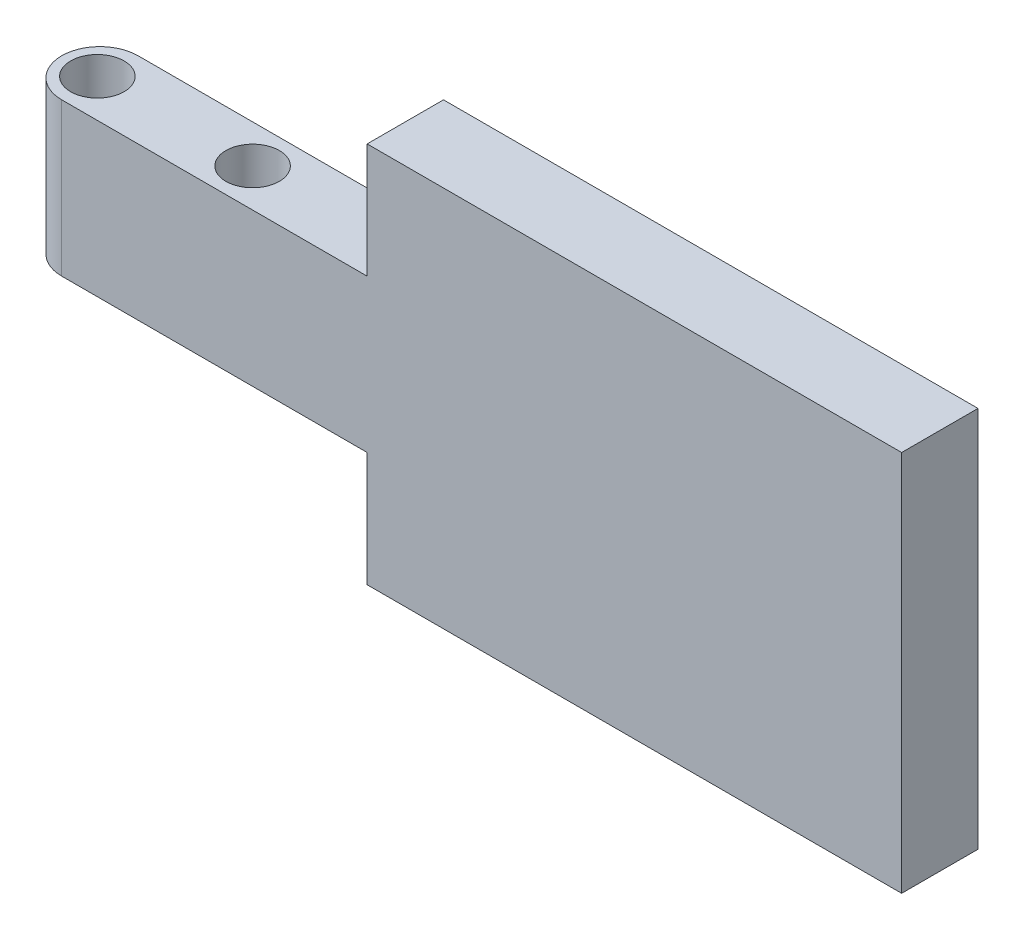
ISO-10303-21;
HEADER;
FILE_DESCRIPTION(('STEP AP214'),'2;1');
FILE_NAME('part.step','',(''),(''),'','','');
FILE_SCHEMA(('AUTOMOTIVE_DESIGN { 1 0 10303 214 1 1 1 1 }'));
ENDSEC;
DATA;
#1=APPLICATION_CONTEXT('core data for automotive mechanical design processes');
#2=APPLICATION_PROTOCOL_DEFINITION('international standard','automotive_design',2000,#1);
#3=PRODUCT_CONTEXT('',#1,'mechanical');
#4=PRODUCT('Part','Part','',(#3));
#5=PRODUCT_RELATED_PRODUCT_CATEGORY('part','',(#4));
#6=PRODUCT_DEFINITION_FORMATION('','',#4);
#7=PRODUCT_DEFINITION_CONTEXT('part definition',#1,'design');
#8=PRODUCT_DEFINITION('design','',#6,#7);
#9=PRODUCT_DEFINITION_SHAPE('','',#8);
#10=(LENGTH_UNIT() NAMED_UNIT(*) SI_UNIT(.MILLI.,.METRE.));
#11=(NAMED_UNIT(*) PLANE_ANGLE_UNIT() SI_UNIT($,.RADIAN.));
#12=(NAMED_UNIT(*) SI_UNIT($,.STERADIAN.) SOLID_ANGLE_UNIT());
#13=UNCERTAINTY_MEASURE_WITH_UNIT(LENGTH_MEASURE(1.E-05),#10,'distance_accuracy_value','');
#14=(GEOMETRIC_REPRESENTATION_CONTEXT(3) GLOBAL_UNCERTAINTY_ASSIGNED_CONTEXT((#13)) GLOBAL_UNIT_ASSIGNED_CONTEXT((#10,
#11,#12)) REPRESENTATION_CONTEXT('',''));
#15=CARTESIAN_POINT('',(0.,0.,0.));
#16=DIRECTION('',(0.,0.,1.));
#17=DIRECTION('',(1.,0.,0.));
#18=AXIS2_PLACEMENT_3D('',#15,#16,#17);
#19=CARTESIAN_POINT('',(-35.,-25.,5.));
#20=DIRECTION('',(1.,0.,0.));
#21=DIRECTION('',(0.,0.,-1.));
#22=AXIS2_PLACEMENT_3D('',#19,#20,#21);
#23=PLANE('',#22);
#24=DIRECTION('',(0.,0.,-1.));
#25=VECTOR('',#24,1.);
#26=CARTESIAN_POINT('',(-35.,10.,-5.));
#27=LINE('',#26,#25);
#28=CARTESIAN_POINT('',(-35.,10.,5.));
#29=VERTEX_POINT('',#28);
#30=CARTESIAN_POINT('',(-35.,10.,-5.));
#31=VERTEX_POINT('',#30);
#32=EDGE_CURVE('E119',#29,#31,#27,.T.);
#33=ORIENTED_EDGE('',*,*,#32,.F.);
#34=DIRECTION('',(0.,1.,0.));
#35=VECTOR('',#34,1.);
#36=CARTESIAN_POINT('',(-35.,-25.,5.));
#37=LINE('',#36,#35);
#38=CARTESIAN_POINT('',(-35.,25.,5.));
#39=VERTEX_POINT('',#38);
#40=EDGE_CURVE('E116',#29,#39,#37,.T.);
#41=ORIENTED_EDGE('',*,*,#40,.T.);
#42=DIRECTION('',(0.,0.,-1.));
#43=VECTOR('',#42,1.);
#44=CARTESIAN_POINT('',(-35.,25.,5.));
#45=LINE('',#44,#43);
#46=CARTESIAN_POINT('',(-35.,25.,-5.));
#47=VERTEX_POINT('',#46);
#48=EDGE_CURVE('E149',#39,#47,#45,.T.);
#49=ORIENTED_EDGE('',*,*,#48,.T.);
#50=DIRECTION('',(0.,1.,0.));
#51=VECTOR('',#50,1.);
#52=CARTESIAN_POINT('',(-35.,-25.,-5.));
#53=LINE('',#52,#51);
#54=EDGE_CURVE('E161',#31,#47,#53,.T.);
#55=ORIENTED_EDGE('',*,*,#54,.F.);
#56=EDGE_LOOP('',(#33,#41,#49,#55));
#57=FACE_BOUND('',#56,.T.);
#58=ADVANCED_FACE('F32',(#57),#23,.F.);
#59=CARTESIAN_POINT('',(-35.,-25.,-5.));
#60=DIRECTION('',(0.,0.,1.));
#61=DIRECTION('',(1.,0.,0.));
#62=AXIS2_PLACEMENT_3D('',#59,#60,#61);
#63=PLANE('',#62);
#64=CARTESIAN_POINT('',(10.,0.,-5.));
#65=DIRECTION('',(0.,0.,1.));
#66=DIRECTION('',(1.,0.,0.));
#67=AXIS2_PLACEMENT_3D('',#64,#65,#66);
#68=CIRCLE('',#67,24.4948974278318);
#69=CARTESIAN_POINT('',(34.4948974278318,0.,-5.));
#70=VERTEX_POINT('',#69);
#71=EDGE_CURVE('E11',#70,#70,#68,.F.);
#72=ORIENTED_EDGE('',*,*,#71,.F.);
#73=EDGE_LOOP('',(#72));
#74=FACE_BOUND('',#73,.T.);
#75=CARTESIAN_POINT('',(-35.,-25.,-5.));
#76=VERTEX_POINT('',#75);
#77=CARTESIAN_POINT('',(-35.,-10.,-5.));
#78=VERTEX_POINT('',#77);
#79=EDGE_CURVE('E162',#76,#78,#53,.T.);
#80=ORIENTED_EDGE('',*,*,#79,.T.);
#81=DIRECTION('',(-1.,0.,0.));
#82=VECTOR('',#81,1.);
#83=CARTESIAN_POINT('',(-75.,-10.,-5.));
#84=LINE('',#83,#82);
#85=CARTESIAN_POINT('',(-75.,-10.,-5.));
#86=VERTEX_POINT('',#85);
#87=EDGE_CURVE('E49',#78,#86,#84,.T.);
#88=ORIENTED_EDGE('',*,*,#87,.T.);
#89=DIRECTION('',(0.,1.,0.));
#90=VECTOR('',#89,1.);
#91=CARTESIAN_POINT('',(-75.,-10.,-5.));
#92=LINE('',#91,#90);
#93=CARTESIAN_POINT('',(-75.,10.,-5.));
#94=VERTEX_POINT('',#93);
#95=EDGE_CURVE('E110',#86,#94,#92,.T.);
#96=ORIENTED_EDGE('',*,*,#95,.T.);
#97=DIRECTION('',(-1.,0.,0.));
#98=VECTOR('',#97,1.);
#99=CARTESIAN_POINT('',(-75.,10.,-5.));
#100=LINE('',#99,#98);
#101=EDGE_CURVE('E124',#31,#94,#100,.T.);
#102=ORIENTED_EDGE('',*,*,#101,.F.);
#103=ORIENTED_EDGE('',*,*,#54,.T.);
#104=DIRECTION('',(1.,0.,0.));
#105=VECTOR('',#104,1.);
#106=CARTESIAN_POINT('',(-35.,25.,-5.));
#107=LINE('',#106,#105);
#108=CARTESIAN_POINT('',(35.,25.,-5.));
#109=VERTEX_POINT('',#108);
#110=EDGE_CURVE('E139',#47,#109,#107,.T.);
#111=ORIENTED_EDGE('',*,*,#110,.T.);
#112=DIRECTION('',(0.,1.,0.));
#113=VECTOR('',#112,1.);
#114=CARTESIAN_POINT('',(35.,-25.,-5.));
#115=LINE('',#114,#113);
#116=CARTESIAN_POINT('',(35.,-25.,-5.));
#117=VERTEX_POINT('',#116);
#118=EDGE_CURVE('E41',#117,#109,#115,.T.);
#119=ORIENTED_EDGE('',*,*,#118,.F.);
#120=DIRECTION('',(1.,0.,0.));
#121=VECTOR('',#120,1.);
#122=CARTESIAN_POINT('',(-35.,-25.,-5.));
#123=LINE('',#122,#121);
#124=EDGE_CURVE('E152',#76,#117,#123,.T.);
#125=ORIENTED_EDGE('',*,*,#124,.F.);
#126=EDGE_LOOP('',(#80,#88,#96,#102,#103,#111,#119,#125));
#127=FACE_BOUND('',#126,.T.);
#128=ADVANCED_FACE('F34',(#74,#127),#63,.F.);
#129=CARTESIAN_POINT('',(35.,-25.,5.));
#130=DIRECTION('',(1.,0.,0.));
#131=DIRECTION('',(0.,0.,-1.));
#132=AXIS2_PLACEMENT_3D('',#129,#130,#131);
#133=PLANE('',#132);
#134=DIRECTION('',(0.,0.,-1.));
#135=VECTOR('',#134,1.);
#136=CARTESIAN_POINT('',(35.,25.,5.));
#137=LINE('',#136,#135);
#138=CARTESIAN_POINT('',(35.,25.,5.));
#139=VERTEX_POINT('',#138);
#140=EDGE_CURVE('E143',#139,#109,#137,.T.);
#141=ORIENTED_EDGE('',*,*,#140,.F.);
#142=DIRECTION('',(0.,1.,0.));
#143=VECTOR('',#142,1.);
#144=CARTESIAN_POINT('',(35.,-25.,5.));
#145=LINE('',#144,#143);
#146=CARTESIAN_POINT('',(35.,-25.,5.));
#147=VERTEX_POINT('',#146);
#148=EDGE_CURVE('E168',#147,#139,#145,.T.);
#149=ORIENTED_EDGE('',*,*,#148,.F.);
#150=DIRECTION('',(0.,0.,-1.));
#151=VECTOR('',#150,1.);
#152=CARTESIAN_POINT('',(35.,-25.,5.));
#153=LINE('',#152,#151);
#154=EDGE_CURVE('E154',#147,#117,#153,.T.);
#155=ORIENTED_EDGE('',*,*,#154,.T.);
#156=ORIENTED_EDGE('',*,*,#118,.T.);
#157=EDGE_LOOP('',(#141,#149,#155,#156));
#158=FACE_BOUND('',#157,.T.);
#159=ADVANCED_FACE('F203',(#158),#133,.T.);
#160=CARTESIAN_POINT('',(-35.,-25.,5.));
#161=DIRECTION('',(0.,0.,1.));
#162=DIRECTION('',(1.,0.,0.));
#163=AXIS2_PLACEMENT_3D('',#160,#161,#162);
#164=PLANE('',#163);
#165=ORIENTED_EDGE('',*,*,#40,.F.);
#166=DIRECTION('',(1.,0.,0.));
#167=VECTOR('',#166,1.);
#168=CARTESIAN_POINT('',(-35.,10.,5.));
#169=LINE('',#168,#167);
#170=CARTESIAN_POINT('',(-75.,10.,5.));
#171=VERTEX_POINT('',#170);
#172=EDGE_CURVE('E113',#171,#29,#169,.T.);
#173=ORIENTED_EDGE('',*,*,#172,.F.);
#174=DIRECTION('',(0.,1.,0.));
#175=VECTOR('',#174,1.);
#176=CARTESIAN_POINT('',(-75.,-10.,5.));
#177=LINE('',#176,#175);
#178=CARTESIAN_POINT('',(-75.,-10.,5.));
#179=VERTEX_POINT('',#178);
#180=EDGE_CURVE('E101',#179,#171,#177,.T.);
#181=ORIENTED_EDGE('',*,*,#180,.F.);
#182=DIRECTION('',(1.,0.,0.));
#183=VECTOR('',#182,1.);
#184=CARTESIAN_POINT('',(-35.,-10.,5.));
#185=LINE('',#184,#183);
#186=CARTESIAN_POINT('',(-35.,-10.,5.));
#187=VERTEX_POINT('',#186);
#188=EDGE_CURVE('E134',#179,#187,#185,.T.);
#189=ORIENTED_EDGE('',*,*,#188,.T.);
#190=CARTESIAN_POINT('',(-35.,-25.,5.));
#191=VERTEX_POINT('',#190);
#192=EDGE_CURVE('E165',#191,#187,#37,.T.);
#193=ORIENTED_EDGE('',*,*,#192,.F.);
#194=DIRECTION('',(1.,0.,0.));
#195=VECTOR('',#194,1.);
#196=CARTESIAN_POINT('',(-35.,-25.,5.));
#197=LINE('',#196,#195);
#198=EDGE_CURVE('E157',#191,#147,#197,.T.);
#199=ORIENTED_EDGE('',*,*,#198,.T.);
#200=ORIENTED_EDGE('',*,*,#148,.T.);
#201=DIRECTION('',(1.,0.,0.));
#202=VECTOR('',#201,1.);
#203=CARTESIAN_POINT('',(-35.,25.,5.));
#204=LINE('',#203,#202);
#205=EDGE_CURVE('E146',#39,#139,#204,.T.);
#206=ORIENTED_EDGE('',*,*,#205,.F.);
#207=EDGE_LOOP('',(#165,#173,#181,#189,#193,#199,#200,#206));
#208=FACE_BOUND('',#207,.T.);
#209=ADVANCED_FACE('F114',(#208),#164,.T.);
#210=ORIENTED_EDGE('',*,*,#192,.T.);
#211=DIRECTION('',(0.,0.,-1.));
#212=VECTOR('',#211,1.);
#213=CARTESIAN_POINT('',(-35.,-10.,-5.));
#214=LINE('',#213,#212);
#215=EDGE_CURVE('E136',#187,#78,#214,.T.);
#216=ORIENTED_EDGE('',*,*,#215,.T.);
#217=ORIENTED_EDGE('',*,*,#79,.F.);
#218=DIRECTION('',(0.,0.,-1.));
#219=VECTOR('',#218,1.);
#220=CARTESIAN_POINT('',(-35.,-25.,5.));
#221=LINE('',#220,#219);
#222=EDGE_CURVE('E57',#191,#76,#221,.T.);
#223=ORIENTED_EDGE('',*,*,#222,.F.);
#224=EDGE_LOOP('',(#210,#216,#217,#223));
#225=FACE_BOUND('',#224,.T.);
#226=ADVANCED_FACE('F198',(#225),#23,.F.);
#227=CARTESIAN_POINT('',(0.,-25.,0.));
#228=DIRECTION('',(0.,1.,0.));
#229=DIRECTION('',(0.,0.,1.));
#230=AXIS2_PLACEMENT_3D('',#227,#228,#229);
#231=PLANE('',#230);
#232=ORIENTED_EDGE('',*,*,#124,.T.);
#233=ORIENTED_EDGE('',*,*,#154,.F.);
#234=ORIENTED_EDGE('',*,*,#198,.F.);
#235=ORIENTED_EDGE('',*,*,#222,.T.);
#236=EDGE_LOOP('',(#232,#233,#234,#235));
#237=FACE_BOUND('',#236,.T.);
#238=ADVANCED_FACE('F200',(#237),#231,.F.);
#239=CARTESIAN_POINT('',(0.,25.,0.));
#240=DIRECTION('',(0.,1.,0.));
#241=DIRECTION('',(0.,0.,1.));
#242=AXIS2_PLACEMENT_3D('',#239,#240,#241);
#243=PLANE('',#242);
#244=ORIENTED_EDGE('',*,*,#110,.F.);
#245=ORIENTED_EDGE('',*,*,#48,.F.);
#246=ORIENTED_EDGE('',*,*,#205,.T.);
#247=ORIENTED_EDGE('',*,*,#140,.T.);
#248=EDGE_LOOP('',(#244,#245,#246,#247));
#249=FACE_BOUND('',#248,.T.);
#250=ADVANCED_FACE('F206',(#249),#243,.T.);
#251=CARTESIAN_POINT('',(-75.,-10.,0.));
#252=DIRECTION('',(0.,1.,0.));
#253=DIRECTION('',(0.,0.,1.));
#254=AXIS2_PLACEMENT_3D('',#251,#252,#253);
#255=CYLINDRICAL_SURFACE('',#254,5.);
#256=ORIENTED_EDGE('',*,*,#180,.T.);
#257=CARTESIAN_POINT('',(-75.,10.,0.));
#258=DIRECTION('',(0.,1.,0.));
#259=DIRECTION('',(0.,0.,1.));
#260=AXIS2_PLACEMENT_3D('',#257,#258,#259);
#261=CIRCLE('',#260,5.);
#262=EDGE_CURVE('E105',#94,#171,#261,.T.);
#263=ORIENTED_EDGE('',*,*,#262,.F.);
#264=ORIENTED_EDGE('',*,*,#95,.F.);
#265=CARTESIAN_POINT('',(-75.,-10.,0.));
#266=DIRECTION('',(0.,1.,0.));
#267=DIRECTION('',(0.,0.,1.));
#268=AXIS2_PLACEMENT_3D('',#265,#266,#267);
#269=CIRCLE('',#268,5.);
#270=EDGE_CURVE('E106',#86,#179,#269,.T.);
#271=ORIENTED_EDGE('',*,*,#270,.T.);
#272=EDGE_LOOP('',(#256,#263,#264,#271));
#273=FACE_BOUND('',#272,.T.);
#274=ADVANCED_FACE('F103',(#273),#255,.T.);
#275=CARTESIAN_POINT('',(-75.,-10.,0.));
#276=DIRECTION('',(0.,1.,0.));
#277=DIRECTION('',(0.,0.,1.));
#278=AXIS2_PLACEMENT_3D('',#275,#276,#277);
#279=PLANE('',#278);
#280=CARTESIAN_POINT('',(-75.3331770971365,-10.,0.));
#281=DIRECTION('',(0.,1.,0.));
#282=DIRECTION('',(0.,0.,1.));
#283=AXIS2_PLACEMENT_3D('',#280,#281,#282);
#284=CIRCLE('',#283,3.50000000000001);
#285=CARTESIAN_POINT('',(-75.3331770971365,-10.,3.50000000000001));
#286=VERTEX_POINT('',#285);
#287=EDGE_CURVE('E125',#286,#286,#284,.F.);
#288=ORIENTED_EDGE('',*,*,#287,.F.);
#289=EDGE_LOOP('',(#288));
#290=FACE_BOUND('',#289,.T.);
#291=CARTESIAN_POINT('',(-55.,-10.,0.));
#292=DIRECTION('',(0.,1.,0.));
#293=DIRECTION('',(0.,0.,1.));
#294=AXIS2_PLACEMENT_3D('',#291,#292,#293);
#295=CIRCLE('',#294,3.5);
#296=CARTESIAN_POINT('',(-55.,-10.,3.5));
#297=VERTEX_POINT('',#296);
#298=EDGE_CURVE('E172',#297,#297,#295,.F.);
#299=ORIENTED_EDGE('',*,*,#298,.F.);
#300=EDGE_LOOP('',(#299));
#301=FACE_BOUND('',#300,.T.);
#302=ORIENTED_EDGE('',*,*,#270,.F.);
#303=ORIENTED_EDGE('',*,*,#87,.F.);
#304=ORIENTED_EDGE('',*,*,#215,.F.);
#305=ORIENTED_EDGE('',*,*,#188,.F.);
#306=EDGE_LOOP('',(#302,#303,#304,#305));
#307=FACE_BOUND('',#306,.T.);
#308=ADVANCED_FACE('F190',(#290,#301,#307),#279,.F.);
#309=CARTESIAN_POINT('',(-75.,10.,0.));
#310=DIRECTION('',(0.,1.,0.));
#311=DIRECTION('',(0.,0.,1.));
#312=AXIS2_PLACEMENT_3D('',#309,#310,#311);
#313=PLANE('',#312);
#314=CARTESIAN_POINT('',(-75.3331770971365,10.,0.));
#315=DIRECTION('',(0.,1.,0.));
#316=DIRECTION('',(0.,0.,1.));
#317=AXIS2_PLACEMENT_3D('',#314,#315,#316);
#318=CIRCLE('',#317,3.50000000000001);
#319=CARTESIAN_POINT('',(-75.3331770971365,10.,3.50000000000001));
#320=VERTEX_POINT('',#319);
#321=EDGE_CURVE('E36',#320,#320,#318,.F.);
#322=ORIENTED_EDGE('',*,*,#321,.T.);
#323=EDGE_LOOP('',(#322));
#324=FACE_BOUND('',#323,.T.);
#325=CARTESIAN_POINT('',(-55.,10.,0.));
#326=DIRECTION('',(0.,1.,0.));
#327=DIRECTION('',(0.,0.,1.));
#328=AXIS2_PLACEMENT_3D('',#325,#326,#327);
#329=CIRCLE('',#328,3.5);
#330=CARTESIAN_POINT('',(-55.,10.,3.5));
#331=VERTEX_POINT('',#330);
#332=EDGE_CURVE('E170',#331,#331,#329,.F.);
#333=ORIENTED_EDGE('',*,*,#332,.T.);
#334=EDGE_LOOP('',(#333));
#335=FACE_BOUND('',#334,.T.);
#336=ORIENTED_EDGE('',*,*,#262,.T.);
#337=ORIENTED_EDGE('',*,*,#172,.T.);
#338=ORIENTED_EDGE('',*,*,#32,.T.);
#339=ORIENTED_EDGE('',*,*,#101,.T.);
#340=EDGE_LOOP('',(#336,#337,#338,#339));
#341=FACE_BOUND('',#340,.T.);
#342=ADVANCED_FACE('F122',(#324,#335,#341),#313,.T.);
#343=CARTESIAN_POINT('',(-55.,19.,0.));
#344=DIRECTION('',(0.,-1.,0.));
#345=DIRECTION('',(0.,0.,-1.));
#346=AXIS2_PLACEMENT_3D('',#343,#344,#345);
#347=CYLINDRICAL_SURFACE('',#346,3.5);
#348=ORIENTED_EDGE('',*,*,#332,.F.);
#349=EDGE_LOOP('',(#348));
#350=FACE_BOUND('',#349,.T.);
#351=ORIENTED_EDGE('',*,*,#298,.T.);
#352=EDGE_LOOP('',(#351));
#353=FACE_BOUND('',#352,.T.);
#354=ADVANCED_FACE('F186',(#350,#353),#347,.F.);
#355=CARTESIAN_POINT('',(-75.3331770971365,19.,0.));
#356=DIRECTION('',(0.,-1.,0.));
#357=DIRECTION('',(0.,0.,-1.));
#358=AXIS2_PLACEMENT_3D('',#355,#356,#357);
#359=CYLINDRICAL_SURFACE('',#358,3.50000000000001);
#360=ORIENTED_EDGE('',*,*,#321,.F.);
#361=EDGE_LOOP('',(#360));
#362=FACE_BOUND('',#361,.T.);
#363=ORIENTED_EDGE('',*,*,#287,.T.);
#364=EDGE_LOOP('',(#363));
#365=FACE_BOUND('',#364,.T.);
#366=ADVANCED_FACE('F182',(#362,#365),#359,.F.);
#367=CARTESIAN_POINT('',(10.,0.,20.));
#368=DIRECTION('',(-1.,0.,0.));
#369=DIRECTION('',(0.,0.707106781186549,-0.707106781186546));
#370=AXIS2_PLACEMENT_3D('',#367,#368,#369);
#371=SPHERICAL_SURFACE('',#370,35.);
#372=CARTESIAN_POINT('',(10.,0.,20.));
#373=DIRECTION('',(0.,0.,1.));
#374=DIRECTION('',(1.,0.,0.));
#375=AXIS2_PLACEMENT_3D('',#372,#373,#374);
#376=SPHERICAL_SURFACE('',#375,35.);
#377=ORIENTED_EDGE('',*,*,#71,.T.);
#378=EDGE_LOOP('',(#377));
#379=FACE_BOUND('',#378,.T.);
#380=ADVANCED_FACE('F185',(#379),#376,.T.);
#381=CLOSED_SHELL('',(#58,#128,#159,#209,#226,#238,#250,#274,#308,#342,#354,#366,#380));
#382=MANIFOLD_SOLID_BREP('B2',#381);
#383=ADVANCED_BREP_SHAPE_REPRESENTATION('',(#18,#382),#14);
#384=SHAPE_DEFINITION_REPRESENTATION(#9,#383);
ENDSEC;
END-ISO-10303-21;
